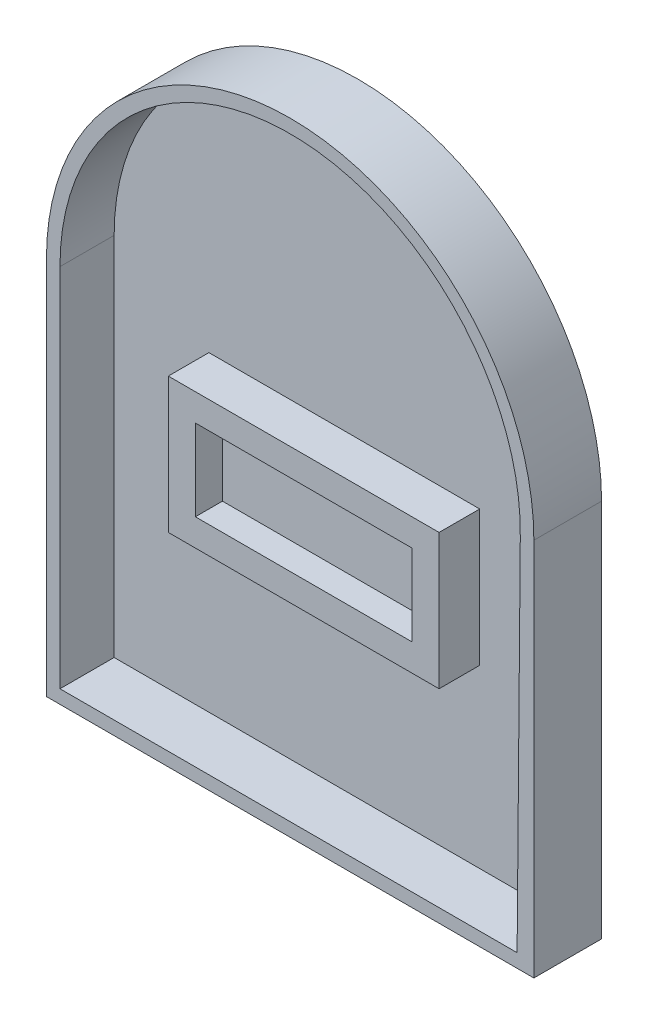
ISO-10303-21;
HEADER;
FILE_DESCRIPTION(('STEP AP214'),'2;1');
FILE_NAME('part.step','',(''),(''),'','','');
FILE_SCHEMA(('AUTOMOTIVE_DESIGN { 1 0 10303 214 1 1 1 1 }'));
ENDSEC;
DATA;
#1=APPLICATION_CONTEXT('core data for automotive mechanical design processes');
#2=APPLICATION_PROTOCOL_DEFINITION('international standard','automotive_design',2000,#1);
#3=PRODUCT_CONTEXT('',#1,'mechanical');
#4=PRODUCT('Part','Part','',(#3));
#5=PRODUCT_RELATED_PRODUCT_CATEGORY('part','',(#4));
#6=PRODUCT_DEFINITION_FORMATION('','',#4);
#7=PRODUCT_DEFINITION_CONTEXT('part definition',#1,'design');
#8=PRODUCT_DEFINITION('design','',#6,#7);
#9=PRODUCT_DEFINITION_SHAPE('','',#8);
#10=(LENGTH_UNIT() NAMED_UNIT(*) SI_UNIT(.MILLI.,.METRE.));
#11=(NAMED_UNIT(*) PLANE_ANGLE_UNIT() SI_UNIT($,.RADIAN.));
#12=(NAMED_UNIT(*) SI_UNIT($,.STERADIAN.) SOLID_ANGLE_UNIT());
#13=UNCERTAINTY_MEASURE_WITH_UNIT(LENGTH_MEASURE(1.E-05),#10,'distance_accuracy_value','');
#14=(GEOMETRIC_REPRESENTATION_CONTEXT(3) GLOBAL_UNCERTAINTY_ASSIGNED_CONTEXT((#13)) GLOBAL_UNIT_ASSIGNED_CONTEXT((#10,
#11,#12)) REPRESENTATION_CONTEXT('',''));
#15=CARTESIAN_POINT('',(0.,0.,0.));
#16=DIRECTION('',(0.,0.,1.));
#17=DIRECTION('',(1.,0.,0.));
#18=AXIS2_PLACEMENT_3D('',#15,#16,#17);
#19=CARTESIAN_POINT('',(0.,0.,0.));
#20=DIRECTION('',(0.,0.,-1.));
#21=DIRECTION('',(-1.,0.,0.));
#22=AXIS2_PLACEMENT_3D('',#19,#20,#21);
#23=PLANE('',#22);
#24=DIRECTION('',(0.00880307623045722,0.999961252173743,0.));
#25=VECTOR('',#24,1.);
#26=CARTESIAN_POINT('',(83.8115386585947,-135.,0.));
#27=LINE('',#26,#25);
#28=CARTESIAN_POINT('',(83.8115386585947,-135.,0.));
#29=VERTEX_POINT('',#28);
#30=CARTESIAN_POINT('',(84.9868259943097,-1.49646497216622,0.));
#31=VERTEX_POINT('',#30);
#32=EDGE_CURVE('E238',#29,#31,#27,.T.);
#33=ORIENTED_EDGE('',*,*,#32,.T.);
#34=CARTESIAN_POINT('',(0.,0.,0.));
#35=DIRECTION('',(0.,0.,1.));
#36=DIRECTION('',(1.,0.,0.));
#37=AXIS2_PLACEMENT_3D('',#34,#35,#36);
#38=CIRCLE('',#37,85.);
#39=CARTESIAN_POINT('',(-85.,0.,0.));
#40=VERTEX_POINT('',#39);
#41=EDGE_CURVE('E234',#31,#40,#38,.T.);
#42=ORIENTED_EDGE('',*,*,#41,.T.);
#43=DIRECTION('',(0.,-1.,0.));
#44=VECTOR('',#43,1.);
#45=CARTESIAN_POINT('',(-85.,0.,0.));
#46=LINE('',#45,#44);
#47=CARTESIAN_POINT('',(-85.,-135.,0.));
#48=VERTEX_POINT('',#47);
#49=EDGE_CURVE('E248',#40,#48,#46,.T.);
#50=ORIENTED_EDGE('',*,*,#49,.T.);
#51=DIRECTION('',(1.,0.,0.));
#52=VECTOR('',#51,1.);
#53=CARTESIAN_POINT('',(-85.,-135.,0.));
#54=LINE('',#53,#52);
#55=EDGE_CURVE('E251',#48,#29,#54,.T.);
#56=ORIENTED_EDGE('',*,*,#55,.T.);
#57=EDGE_LOOP('',(#33,#42,#50,#56));
#58=FACE_BOUND('',#57,.T.);
#59=DIRECTION('',(0.,1.,0.));
#60=VECTOR('',#59,1.);
#61=CARTESIAN_POINT('',(50.,-20.,0.));
#62=LINE('',#61,#60);
#63=CARTESIAN_POINT('',(50.,-70.,0.));
#64=VERTEX_POINT('',#63);
#65=CARTESIAN_POINT('',(50.,-20.,0.));
#66=VERTEX_POINT('',#65);
#67=EDGE_CURVE('E192',#64,#66,#62,.T.);
#68=ORIENTED_EDGE('',*,*,#67,.F.);
#69=DIRECTION('',(1.,0.,0.));
#70=VECTOR('',#69,1.);
#71=CARTESIAN_POINT('',(-50.,-70.,0.));
#72=LINE('',#71,#70);
#73=CARTESIAN_POINT('',(-50.,-70.,0.));
#74=VERTEX_POINT('',#73);
#75=EDGE_CURVE('E197',#74,#64,#72,.T.);
#76=ORIENTED_EDGE('',*,*,#75,.F.);
#77=DIRECTION('',(0.,-1.,0.));
#78=VECTOR('',#77,1.);
#79=CARTESIAN_POINT('',(-50.,-20.,0.));
#80=LINE('',#79,#78);
#81=CARTESIAN_POINT('',(-50.,-20.,0.));
#82=VERTEX_POINT('',#81);
#83=EDGE_CURVE('E207',#82,#74,#80,.T.);
#84=ORIENTED_EDGE('',*,*,#83,.F.);
#85=DIRECTION('',(-1.,0.,0.));
#86=VECTOR('',#85,1.);
#87=CARTESIAN_POINT('',(-50.,-20.,0.));
#88=LINE('',#87,#86);
#89=EDGE_CURVE('E64',#66,#82,#88,.T.);
#90=ORIENTED_EDGE('',*,*,#89,.F.);
#91=EDGE_LOOP('',(#68,#76,#84,#90));
#92=FACE_BOUND('',#91,.T.);
#93=ADVANCED_FACE('F41',(#58,#92),#23,.F.);
#94=CARTESIAN_POINT('',(0.,0.,20.));
#95=DIRECTION('',(0.,0.,1.));
#96=DIRECTION('',(1.,0.,0.));
#97=AXIS2_PLACEMENT_3D('',#94,#95,#96);
#98=PLANE('',#97);
#99=CARTESIAN_POINT('',(0.,0.,20.));
#100=DIRECTION('',(0.,0.,1.));
#101=DIRECTION('',(1.,0.,0.));
#102=AXIS2_PLACEMENT_3D('',#99,#100,#101);
#103=CIRCLE('',#102,90.);
#104=CARTESIAN_POINT('',(90.,0.,20.));
#105=VERTEX_POINT('',#104);
#106=CARTESIAN_POINT('',(-90.,0.,20.));
#107=VERTEX_POINT('',#106);
#108=EDGE_CURVE('E264',#105,#107,#103,.T.);
#109=ORIENTED_EDGE('',*,*,#108,.T.);
#110=DIRECTION('',(0.,-1.,0.));
#111=VECTOR('',#110,1.);
#112=CARTESIAN_POINT('',(-90.,0.,20.));
#113=LINE('',#112,#111);
#114=CARTESIAN_POINT('',(-90.,-140.,20.));
#115=VERTEX_POINT('',#114);
#116=EDGE_CURVE('E267',#107,#115,#113,.T.);
#117=ORIENTED_EDGE('',*,*,#116,.T.);
#118=DIRECTION('',(1.,0.,0.));
#119=VECTOR('',#118,1.);
#120=CARTESIAN_POINT('',(-90.,-140.,20.));
#121=LINE('',#120,#119);
#122=CARTESIAN_POINT('',(90.,-140.,20.));
#123=VERTEX_POINT('',#122);
#124=EDGE_CURVE('E269',#115,#123,#121,.T.);
#125=ORIENTED_EDGE('',*,*,#124,.T.);
#126=DIRECTION('',(0.,1.,0.));
#127=VECTOR('',#126,1.);
#128=CARTESIAN_POINT('',(90.,-140.,20.));
#129=LINE('',#128,#127);
#130=EDGE_CURVE('E271',#123,#105,#129,.T.);
#131=ORIENTED_EDGE('',*,*,#130,.T.);
#132=EDGE_LOOP('',(#109,#117,#125,#131));
#133=FACE_BOUND('',#132,.T.);
#134=DIRECTION('',(0.,-1.,0.));
#135=VECTOR('',#134,1.);
#136=CARTESIAN_POINT('',(-85.,0.,20.));
#137=LINE('',#136,#135);
#138=CARTESIAN_POINT('',(-85.,0.,20.));
#139=VERTEX_POINT('',#138);
#140=CARTESIAN_POINT('',(-85.,-135.,20.));
#141=VERTEX_POINT('',#140);
#142=EDGE_CURVE('E237',#139,#141,#137,.T.);
#143=ORIENTED_EDGE('',*,*,#142,.F.);
#144=CARTESIAN_POINT('',(0.,0.,20.));
#145=DIRECTION('',(0.,0.,1.));
#146=DIRECTION('',(1.,0.,0.));
#147=AXIS2_PLACEMENT_3D('',#144,#145,#146);
#148=CIRCLE('',#147,85.);
#149=CARTESIAN_POINT('',(84.9868259943097,-1.49646497216622,20.));
#150=VERTEX_POINT('',#149);
#151=EDGE_CURVE('E235',#150,#139,#148,.T.);
#152=ORIENTED_EDGE('',*,*,#151,.F.);
#153=DIRECTION('',(0.00880307623045722,0.999961252173743,0.));
#154=VECTOR('',#153,1.);
#155=CARTESIAN_POINT('',(83.8115386585947,-135.,20.));
#156=LINE('',#155,#154);
#157=CARTESIAN_POINT('',(83.8115386585947,-135.,20.));
#158=VERTEX_POINT('',#157);
#159=EDGE_CURVE('E243',#158,#150,#156,.T.);
#160=ORIENTED_EDGE('',*,*,#159,.F.);
#161=DIRECTION('',(1.,0.,0.));
#162=VECTOR('',#161,1.);
#163=CARTESIAN_POINT('',(-85.,-135.,20.));
#164=LINE('',#163,#162);
#165=EDGE_CURVE('E240',#141,#158,#164,.T.);
#166=ORIENTED_EDGE('',*,*,#165,.F.);
#167=EDGE_LOOP('',(#143,#152,#160,#166));
#168=FACE_BOUND('',#167,.T.);
#169=ADVANCED_FACE('F297',(#133,#168),#98,.T.);
#170=CARTESIAN_POINT('',(0.,0.,20.));
#171=DIRECTION('',(0.,0.,-1.));
#172=DIRECTION('',(-1.,0.,0.));
#173=AXIS2_PLACEMENT_3D('',#170,#171,#172);
#174=CYLINDRICAL_SURFACE('',#173,90.);
#175=DIRECTION('',(0.,0.,-1.));
#176=VECTOR('',#175,1.);
#177=CARTESIAN_POINT('',(90.,0.,20.));
#178=LINE('',#177,#176);
#179=CARTESIAN_POINT('',(90.,0.,-5.));
#180=VERTEX_POINT('',#179);
#181=EDGE_CURVE('E273',#105,#180,#178,.T.);
#182=ORIENTED_EDGE('',*,*,#181,.T.);
#183=CARTESIAN_POINT('',(0.,0.,-5.));
#184=DIRECTION('',(0.,0.,-1.));
#185=DIRECTION('',(-1.,0.,0.));
#186=AXIS2_PLACEMENT_3D('',#183,#184,#185);
#187=CIRCLE('',#186,90.);
#188=CARTESIAN_POINT('',(-90.,0.,-5.));
#189=VERTEX_POINT('',#188);
#190=EDGE_CURVE('E222',#189,#180,#187,.T.);
#191=ORIENTED_EDGE('',*,*,#190,.F.);
#192=DIRECTION('',(0.,0.,-1.));
#193=VECTOR('',#192,1.);
#194=CARTESIAN_POINT('',(-90.,0.,20.));
#195=LINE('',#194,#193);
#196=EDGE_CURVE('E11',#107,#189,#195,.T.);
#197=ORIENTED_EDGE('',*,*,#196,.F.);
#198=ORIENTED_EDGE('',*,*,#108,.F.);
#199=EDGE_LOOP('',(#182,#191,#197,#198));
#200=FACE_BOUND('',#199,.T.);
#201=ADVANCED_FACE('F43',(#200),#174,.T.);
#202=CARTESIAN_POINT('',(-90.,0.,20.));
#203=DIRECTION('',(1.,0.,0.));
#204=DIRECTION('',(0.,0.,-1.));
#205=AXIS2_PLACEMENT_3D('',#202,#203,#204);
#206=PLANE('',#205);
#207=ORIENTED_EDGE('',*,*,#196,.T.);
#208=DIRECTION('',(0.,1.,0.));
#209=VECTOR('',#208,1.);
#210=CARTESIAN_POINT('',(-90.,-140.,-5.));
#211=LINE('',#210,#209);
#212=CARTESIAN_POINT('',(-90.,-140.,-5.));
#213=VERTEX_POINT('',#212);
#214=EDGE_CURVE('E231',#213,#189,#211,.T.);
#215=ORIENTED_EDGE('',*,*,#214,.F.);
#216=DIRECTION('',(0.,0.,-1.));
#217=VECTOR('',#216,1.);
#218=CARTESIAN_POINT('',(-90.,-140.,20.));
#219=LINE('',#218,#217);
#220=EDGE_CURVE('E49',#115,#213,#219,.T.);
#221=ORIENTED_EDGE('',*,*,#220,.F.);
#222=ORIENTED_EDGE('',*,*,#116,.F.);
#223=EDGE_LOOP('',(#207,#215,#221,#222));
#224=FACE_BOUND('',#223,.T.);
#225=ADVANCED_FACE('F288',(#224),#206,.F.);
#226=CARTESIAN_POINT('',(-90.,-140.,20.));
#227=DIRECTION('',(0.,1.,0.));
#228=DIRECTION('',(0.,0.,1.));
#229=AXIS2_PLACEMENT_3D('',#226,#227,#228);
#230=PLANE('',#229);
#231=ORIENTED_EDGE('',*,*,#220,.T.);
#232=DIRECTION('',(-1.,0.,0.));
#233=VECTOR('',#232,1.);
#234=CARTESIAN_POINT('',(90.,-140.,-5.));
#235=LINE('',#234,#233);
#236=CARTESIAN_POINT('',(90.,-140.,-5.));
#237=VERTEX_POINT('',#236);
#238=EDGE_CURVE('E228',#237,#213,#235,.T.);
#239=ORIENTED_EDGE('',*,*,#238,.F.);
#240=DIRECTION('',(0.,0.,-1.));
#241=VECTOR('',#240,1.);
#242=CARTESIAN_POINT('',(90.,-140.,20.));
#243=LINE('',#242,#241);
#244=EDGE_CURVE('E275',#123,#237,#243,.T.);
#245=ORIENTED_EDGE('',*,*,#244,.F.);
#246=ORIENTED_EDGE('',*,*,#124,.F.);
#247=EDGE_LOOP('',(#231,#239,#245,#246));
#248=FACE_BOUND('',#247,.T.);
#249=ADVANCED_FACE('F280',(#248),#230,.F.);
#250=CARTESIAN_POINT('',(90.,-140.,20.));
#251=DIRECTION('',(-1.,0.,0.));
#252=DIRECTION('',(0.,0.,1.));
#253=AXIS2_PLACEMENT_3D('',#250,#251,#252);
#254=PLANE('',#253);
#255=ORIENTED_EDGE('',*,*,#244,.T.);
#256=DIRECTION('',(0.,-1.,0.));
#257=VECTOR('',#256,1.);
#258=CARTESIAN_POINT('',(90.,0.,-5.));
#259=LINE('',#258,#257);
#260=EDGE_CURVE('E225',#180,#237,#259,.T.);
#261=ORIENTED_EDGE('',*,*,#260,.F.);
#262=ORIENTED_EDGE('',*,*,#181,.F.);
#263=ORIENTED_EDGE('',*,*,#130,.F.);
#264=EDGE_LOOP('',(#255,#261,#262,#263));
#265=FACE_BOUND('',#264,.T.);
#266=ADVANCED_FACE('F295',(#265),#254,.F.);
#267=CARTESIAN_POINT('',(0.,0.,20.));
#268=DIRECTION('',(0.,0.,-1.));
#269=DIRECTION('',(-1.,0.,0.));
#270=AXIS2_PLACEMENT_3D('',#267,#268,#269);
#271=CYLINDRICAL_SURFACE('',#270,85.);
#272=ORIENTED_EDGE('',*,*,#41,.F.);
#273=DIRECTION('',(0.,0.,-1.));
#274=VECTOR('',#273,1.);
#275=CARTESIAN_POINT('',(84.9868259943097,-1.49646497216622,20.));
#276=LINE('',#275,#274);
#277=EDGE_CURVE('E245',#150,#31,#276,.T.);
#278=ORIENTED_EDGE('',*,*,#277,.F.);
#279=ORIENTED_EDGE('',*,*,#151,.T.);
#280=DIRECTION('',(0.,0.,-1.));
#281=VECTOR('',#280,1.);
#282=CARTESIAN_POINT('',(-85.,0.,20.));
#283=LINE('',#282,#281);
#284=EDGE_CURVE('E261',#139,#40,#283,.T.);
#285=ORIENTED_EDGE('',*,*,#284,.T.);
#286=EDGE_LOOP('',(#272,#278,#279,#285));
#287=FACE_BOUND('',#286,.T.);
#288=ADVANCED_FACE('F316',(#287),#271,.F.);
#289=CARTESIAN_POINT('',(-85.,0.,20.));
#290=DIRECTION('',(1.,0.,0.));
#291=DIRECTION('',(0.,1.,0.));
#292=AXIS2_PLACEMENT_3D('',#289,#290,#291);
#293=PLANE('',#292);
#294=ORIENTED_EDGE('',*,*,#49,.F.);
#295=ORIENTED_EDGE('',*,*,#284,.F.);
#296=ORIENTED_EDGE('',*,*,#142,.T.);
#297=DIRECTION('',(0.,0.,-1.));
#298=VECTOR('',#297,1.);
#299=CARTESIAN_POINT('',(-85.,-135.,20.));
#300=LINE('',#299,#298);
#301=EDGE_CURVE('E259',#141,#48,#300,.T.);
#302=ORIENTED_EDGE('',*,*,#301,.T.);
#303=EDGE_LOOP('',(#294,#295,#296,#302));
#304=FACE_BOUND('',#303,.T.);
#305=ADVANCED_FACE('F308',(#304),#293,.T.);
#306=CARTESIAN_POINT('',(-85.,-135.,20.));
#307=DIRECTION('',(0.,1.,0.));
#308=DIRECTION('',(0.,0.,1.));
#309=AXIS2_PLACEMENT_3D('',#306,#307,#308);
#310=PLANE('',#309);
#311=ORIENTED_EDGE('',*,*,#55,.F.);
#312=ORIENTED_EDGE('',*,*,#301,.F.);
#313=ORIENTED_EDGE('',*,*,#165,.T.);
#314=DIRECTION('',(0.,0.,-1.));
#315=VECTOR('',#314,1.);
#316=CARTESIAN_POINT('',(83.8115386585947,-135.,20.));
#317=LINE('',#316,#315);
#318=EDGE_CURVE('E257',#158,#29,#317,.T.);
#319=ORIENTED_EDGE('',*,*,#318,.T.);
#320=EDGE_LOOP('',(#311,#312,#313,#319));
#321=FACE_BOUND('',#320,.T.);
#322=ADVANCED_FACE('F311',(#321),#310,.T.);
#323=CARTESIAN_POINT('',(83.8115386585947,-135.,20.));
#324=DIRECTION('',(-0.999961252173743,0.00880307623045722,0.));
#325=DIRECTION('',(-0.00880307623045722,-0.999961252173743,0.));
#326=AXIS2_PLACEMENT_3D('',#323,#324,#325);
#327=PLANE('',#326);
#328=ORIENTED_EDGE('',*,*,#32,.F.);
#329=ORIENTED_EDGE('',*,*,#318,.F.);
#330=ORIENTED_EDGE('',*,*,#159,.T.);
#331=ORIENTED_EDGE('',*,*,#277,.T.);
#332=EDGE_LOOP('',(#328,#329,#330,#331));
#333=FACE_BOUND('',#332,.T.);
#334=ADVANCED_FACE('F319',(#333),#327,.T.);
#335=CARTESIAN_POINT('',(0.,0.,-5.));
#336=DIRECTION('',(0.,0.,-1.));
#337=DIRECTION('',(-1.,0.,0.));
#338=AXIS2_PLACEMENT_3D('',#335,#336,#337);
#339=PLANE('',#338);
#340=ORIENTED_EDGE('',*,*,#190,.T.);
#341=ORIENTED_EDGE('',*,*,#260,.T.);
#342=ORIENTED_EDGE('',*,*,#238,.T.);
#343=ORIENTED_EDGE('',*,*,#214,.T.);
#344=EDGE_LOOP('',(#340,#341,#342,#343));
#345=FACE_BOUND('',#344,.T.);
#346=ADVANCED_FACE('F285',(#345),#339,.T.);
#347=CARTESIAN_POINT('',(50.,-20.,15.));
#348=DIRECTION('',(-1.,0.,0.));
#349=DIRECTION('',(0.,-1.,0.));
#350=AXIS2_PLACEMENT_3D('',#347,#348,#349);
#351=PLANE('',#350);
#352=ORIENTED_EDGE('',*,*,#67,.T.);
#353=DIRECTION('',(0.,0.,-1.));
#354=VECTOR('',#353,1.);
#355=CARTESIAN_POINT('',(50.,-20.,15.));
#356=LINE('',#355,#354);
#357=CARTESIAN_POINT('',(50.,-20.,15.));
#358=VERTEX_POINT('',#357);
#359=EDGE_CURVE('E220',#358,#66,#356,.T.);
#360=ORIENTED_EDGE('',*,*,#359,.F.);
#361=DIRECTION('',(0.,1.,0.));
#362=VECTOR('',#361,1.);
#363=CARTESIAN_POINT('',(50.,-20.,15.));
#364=LINE('',#363,#362);
#365=CARTESIAN_POINT('',(50.,-70.,15.));
#366=VERTEX_POINT('',#365);
#367=EDGE_CURVE('E193',#366,#358,#364,.T.);
#368=ORIENTED_EDGE('',*,*,#367,.F.);
#369=DIRECTION('',(0.,0.,-1.));
#370=VECTOR('',#369,1.);
#371=CARTESIAN_POINT('',(50.,-70.,15.));
#372=LINE('',#371,#370);
#373=EDGE_CURVE('E203',#366,#64,#372,.T.);
#374=ORIENTED_EDGE('',*,*,#373,.T.);
#375=EDGE_LOOP('',(#352,#360,#368,#374));
#376=FACE_BOUND('',#375,.T.);
#377=ADVANCED_FACE('F326',(#376),#351,.F.);
#378=CARTESIAN_POINT('',(-50.,-20.,15.));
#379=DIRECTION('',(0.,-1.,0.));
#380=DIRECTION('',(0.,0.,-1.));
#381=AXIS2_PLACEMENT_3D('',#378,#379,#380);
#382=PLANE('',#381);
#383=ORIENTED_EDGE('',*,*,#89,.T.);
#384=DIRECTION('',(0.,0.,-1.));
#385=VECTOR('',#384,1.);
#386=CARTESIAN_POINT('',(-50.,-20.,15.));
#387=LINE('',#386,#385);
#388=CARTESIAN_POINT('',(-50.,-20.,15.));
#389=VERTEX_POINT('',#388);
#390=EDGE_CURVE('E217',#389,#82,#387,.T.);
#391=ORIENTED_EDGE('',*,*,#390,.F.);
#392=DIRECTION('',(-1.,0.,0.));
#393=VECTOR('',#392,1.);
#394=CARTESIAN_POINT('',(-50.,-20.,15.));
#395=LINE('',#394,#393);
#396=EDGE_CURVE('E196',#358,#389,#395,.T.);
#397=ORIENTED_EDGE('',*,*,#396,.F.);
#398=ORIENTED_EDGE('',*,*,#359,.T.);
#399=EDGE_LOOP('',(#383,#391,#397,#398));
#400=FACE_BOUND('',#399,.T.);
#401=ADVANCED_FACE('F337',(#400),#382,.F.);
#402=CARTESIAN_POINT('',(-50.,-20.,15.));
#403=DIRECTION('',(1.,0.,0.));
#404=DIRECTION('',(0.,1.,0.));
#405=AXIS2_PLACEMENT_3D('',#402,#403,#404);
#406=PLANE('',#405);
#407=ORIENTED_EDGE('',*,*,#83,.T.);
#408=DIRECTION('',(0.,0.,-1.));
#409=VECTOR('',#408,1.);
#410=CARTESIAN_POINT('',(-50.,-70.,15.));
#411=LINE('',#410,#409);
#412=CARTESIAN_POINT('',(-50.,-70.,15.));
#413=VERTEX_POINT('',#412);
#414=EDGE_CURVE('E214',#413,#74,#411,.T.);
#415=ORIENTED_EDGE('',*,*,#414,.F.);
#416=DIRECTION('',(0.,-1.,0.));
#417=VECTOR('',#416,1.);
#418=CARTESIAN_POINT('',(-50.,-20.,15.));
#419=LINE('',#418,#417);
#420=EDGE_CURVE('E199',#389,#413,#419,.T.);
#421=ORIENTED_EDGE('',*,*,#420,.F.);
#422=ORIENTED_EDGE('',*,*,#390,.T.);
#423=EDGE_LOOP('',(#407,#415,#421,#422));
#424=FACE_BOUND('',#423,.T.);
#425=ADVANCED_FACE('F341',(#424),#406,.F.);
#426=CARTESIAN_POINT('',(-50.,-70.,15.));
#427=DIRECTION('',(0.,1.,0.));
#428=DIRECTION('',(0.,0.,1.));
#429=AXIS2_PLACEMENT_3D('',#426,#427,#428);
#430=PLANE('',#429);
#431=ORIENTED_EDGE('',*,*,#75,.T.);
#432=ORIENTED_EDGE('',*,*,#373,.F.);
#433=DIRECTION('',(1.,0.,0.));
#434=VECTOR('',#433,1.);
#435=CARTESIAN_POINT('',(-50.,-70.,15.));
#436=LINE('',#435,#434);
#437=EDGE_CURVE('E201',#413,#366,#436,.T.);
#438=ORIENTED_EDGE('',*,*,#437,.F.);
#439=ORIENTED_EDGE('',*,*,#414,.T.);
#440=EDGE_LOOP('',(#431,#432,#438,#439));
#441=FACE_BOUND('',#440,.T.);
#442=ADVANCED_FACE('F344',(#441),#430,.F.);
#443=CARTESIAN_POINT('',(0.,0.,15.));
#444=DIRECTION('',(0.,0.,1.));
#445=DIRECTION('',(1.,0.,0.));
#446=AXIS2_PLACEMENT_3D('',#443,#444,#445);
#447=PLANE('',#446);
#448=DIRECTION('',(0.,1.,0.));
#449=VECTOR('',#448,1.);
#450=CARTESIAN_POINT('',(40.,-20.,15.));
#451=LINE('',#450,#449);
#452=CARTESIAN_POINT('',(40.,-60.,15.));
#453=VERTEX_POINT('',#452);
#454=CARTESIAN_POINT('',(40.,-30.,15.));
#455=VERTEX_POINT('',#454);
#456=EDGE_CURVE('E154',#453,#455,#451,.T.);
#457=ORIENTED_EDGE('',*,*,#456,.F.);
#458=DIRECTION('',(1.,0.,0.));
#459=VECTOR('',#458,1.);
#460=CARTESIAN_POINT('',(-50.,-60.,15.));
#461=LINE('',#460,#459);
#462=CARTESIAN_POINT('',(-40.,-60.,15.));
#463=VERTEX_POINT('',#462);
#464=EDGE_CURVE('E179',#463,#453,#461,.T.);
#465=ORIENTED_EDGE('',*,*,#464,.F.);
#466=DIRECTION('',(0.,-1.,0.));
#467=VECTOR('',#466,1.);
#468=CARTESIAN_POINT('',(-40.,-20.,15.));
#469=LINE('',#468,#467);
#470=CARTESIAN_POINT('',(-40.,-30.,15.));
#471=VERTEX_POINT('',#470);
#472=EDGE_CURVE('E177',#471,#463,#469,.T.);
#473=ORIENTED_EDGE('',*,*,#472,.F.);
#474=DIRECTION('',(-1.,0.,0.));
#475=VECTOR('',#474,1.);
#476=CARTESIAN_POINT('',(-50.,-30.,15.));
#477=LINE('',#476,#475);
#478=EDGE_CURVE('E163',#455,#471,#477,.T.);
#479=ORIENTED_EDGE('',*,*,#478,.F.);
#480=EDGE_LOOP('',(#457,#465,#473,#479));
#481=FACE_BOUND('',#480,.T.);
#482=ORIENTED_EDGE('',*,*,#367,.T.);
#483=ORIENTED_EDGE('',*,*,#396,.T.);
#484=ORIENTED_EDGE('',*,*,#420,.T.);
#485=ORIENTED_EDGE('',*,*,#437,.T.);
#486=EDGE_LOOP('',(#482,#483,#484,#485));
#487=FACE_BOUND('',#486,.T.);
#488=ADVANCED_FACE('F175',(#481,#487),#447,.T.);
#489=CARTESIAN_POINT('',(-50.,-60.,15.));
#490=DIRECTION('',(0.,1.,0.));
#491=DIRECTION('',(0.,0.,1.));
#492=AXIS2_PLACEMENT_3D('',#489,#490,#491);
#493=PLANE('',#492);
#494=DIRECTION('',(0.,0.,-1.));
#495=VECTOR('',#494,1.);
#496=CARTESIAN_POINT('',(-40.,-60.,15.));
#497=LINE('',#496,#495);
#498=CARTESIAN_POINT('',(-40.,-60.,5.));
#499=VERTEX_POINT('',#498);
#500=EDGE_CURVE('E56',#463,#499,#497,.T.);
#501=ORIENTED_EDGE('',*,*,#500,.F.);
#502=ORIENTED_EDGE('',*,*,#464,.T.);
#503=DIRECTION('',(0.,0.,-1.));
#504=VECTOR('',#503,1.);
#505=CARTESIAN_POINT('',(40.,-60.,15.));
#506=LINE('',#505,#504);
#507=CARTESIAN_POINT('',(40.,-60.,5.));
#508=VERTEX_POINT('',#507);
#509=EDGE_CURVE('E159',#453,#508,#506,.T.);
#510=ORIENTED_EDGE('',*,*,#509,.T.);
#511=DIRECTION('',(1.,0.,0.));
#512=VECTOR('',#511,1.);
#513=CARTESIAN_POINT('',(0.,-60.,5.));
#514=LINE('',#513,#512);
#515=EDGE_CURVE('E189',#499,#508,#514,.T.);
#516=ORIENTED_EDGE('',*,*,#515,.F.);
#517=EDGE_LOOP('',(#501,#502,#510,#516));
#518=FACE_BOUND('',#517,.T.);
#519=ADVANCED_FACE('F351',(#518),#493,.T.);
#520=CARTESIAN_POINT('',(-40.,-20.,15.));
#521=DIRECTION('',(1.,0.,0.));
#522=DIRECTION('',(0.,1.,0.));
#523=AXIS2_PLACEMENT_3D('',#520,#521,#522);
#524=PLANE('',#523);
#525=DIRECTION('',(0.,0.,-1.));
#526=VECTOR('',#525,1.);
#527=CARTESIAN_POINT('',(-40.,-30.,15.));
#528=LINE('',#527,#526);
#529=CARTESIAN_POINT('',(-40.,-30.,5.));
#530=VERTEX_POINT('',#529);
#531=EDGE_CURVE('E172',#471,#530,#528,.T.);
#532=ORIENTED_EDGE('',*,*,#531,.F.);
#533=ORIENTED_EDGE('',*,*,#472,.T.);
#534=ORIENTED_EDGE('',*,*,#500,.T.);
#535=DIRECTION('',(0.,-1.,0.));
#536=VECTOR('',#535,1.);
#537=CARTESIAN_POINT('',(-40.,0.,5.));
#538=LINE('',#537,#536);
#539=EDGE_CURVE('E186',#530,#499,#538,.T.);
#540=ORIENTED_EDGE('',*,*,#539,.F.);
#541=EDGE_LOOP('',(#532,#533,#534,#540));
#542=FACE_BOUND('',#541,.T.);
#543=ADVANCED_FACE('F354',(#542),#524,.T.);
#544=CARTESIAN_POINT('',(-50.,-30.,15.));
#545=DIRECTION('',(0.,-1.,0.));
#546=DIRECTION('',(0.,0.,-1.));
#547=AXIS2_PLACEMENT_3D('',#544,#545,#546);
#548=PLANE('',#547);
#549=DIRECTION('',(0.,0.,-1.));
#550=VECTOR('',#549,1.);
#551=CARTESIAN_POINT('',(40.,-30.,15.));
#552=LINE('',#551,#550);
#553=CARTESIAN_POINT('',(40.,-30.,5.));
#554=VERTEX_POINT('',#553);
#555=EDGE_CURVE('E157',#455,#554,#552,.T.);
#556=ORIENTED_EDGE('',*,*,#555,.F.);
#557=ORIENTED_EDGE('',*,*,#478,.T.);
#558=ORIENTED_EDGE('',*,*,#531,.T.);
#559=DIRECTION('',(-1.,0.,0.));
#560=VECTOR('',#559,1.);
#561=CARTESIAN_POINT('',(0.,-30.,5.));
#562=LINE('',#561,#560);
#563=EDGE_CURVE('E169',#554,#530,#562,.T.);
#564=ORIENTED_EDGE('',*,*,#563,.F.);
#565=EDGE_LOOP('',(#556,#557,#558,#564));
#566=FACE_BOUND('',#565,.T.);
#567=ADVANCED_FACE('F166',(#566),#548,.T.);
#568=CARTESIAN_POINT('',(40.,-20.,15.));
#569=DIRECTION('',(-1.,0.,0.));
#570=DIRECTION('',(0.,-1.,0.));
#571=AXIS2_PLACEMENT_3D('',#568,#569,#570);
#572=PLANE('',#571);
#573=ORIENTED_EDGE('',*,*,#509,.F.);
#574=ORIENTED_EDGE('',*,*,#456,.T.);
#575=ORIENTED_EDGE('',*,*,#555,.T.);
#576=DIRECTION('',(0.,1.,0.));
#577=VECTOR('',#576,1.);
#578=CARTESIAN_POINT('',(40.,0.,5.));
#579=LINE('',#578,#577);
#580=EDGE_CURVE('E171',#508,#554,#579,.T.);
#581=ORIENTED_EDGE('',*,*,#580,.F.);
#582=EDGE_LOOP('',(#573,#574,#575,#581));
#583=FACE_BOUND('',#582,.T.);
#584=ADVANCED_FACE('F156',(#583),#572,.T.);
#585=CARTESIAN_POINT('',(0.,0.,5.));
#586=DIRECTION('',(0.,0.,-1.));
#587=DIRECTION('',(-1.,0.,0.));
#588=AXIS2_PLACEMENT_3D('',#585,#586,#587);
#589=PLANE('',#588);
#590=ORIENTED_EDGE('',*,*,#515,.T.);
#591=ORIENTED_EDGE('',*,*,#580,.T.);
#592=ORIENTED_EDGE('',*,*,#563,.T.);
#593=ORIENTED_EDGE('',*,*,#539,.T.);
#594=EDGE_LOOP('',(#590,#591,#592,#593));
#595=FACE_BOUND('',#594,.T.);
#596=ADVANCED_FACE('F362',(#595),#589,.F.);
#597=CLOSED_SHELL('',(#93,#169,#201,#225,#249,#266,#288,#305,#322,#334,#346,#377,#401,#425,#442,
#488,#519,#543,#567,#584,#596));
#598=MANIFOLD_SOLID_BREP('B2',#597);
#599=ADVANCED_BREP_SHAPE_REPRESENTATION('',(#18,#598),#14);
#600=SHAPE_DEFINITION_REPRESENTATION(#9,#599);
ENDSEC;
END-ISO-10303-21;
